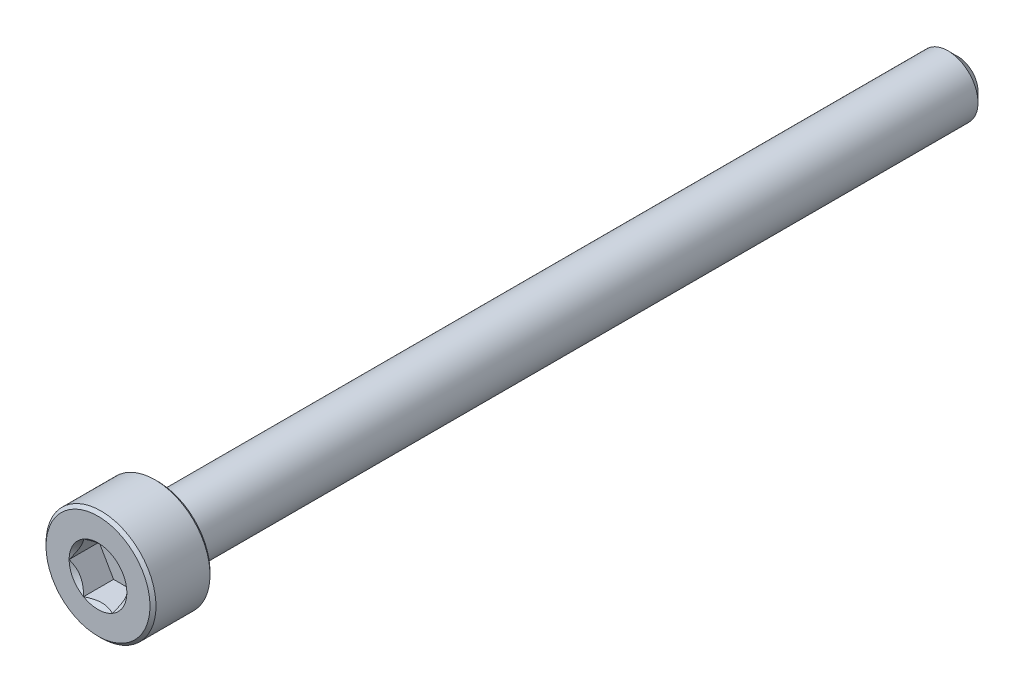
ISO-10303-21;
HEADER;
FILE_DESCRIPTION(('STEP AP214'),'2;1');
FILE_NAME('part.step','',(''),(''),'','','');
FILE_SCHEMA(('AUTOMOTIVE_DESIGN { 1 0 10303 214 1 1 1 1 }'));
ENDSEC;
DATA;
#1=APPLICATION_CONTEXT('core data for automotive mechanical design processes');
#2=APPLICATION_PROTOCOL_DEFINITION('international standard','automotive_design',2000,#1);
#3=PRODUCT_CONTEXT('',#1,'mechanical');
#4=PRODUCT('Part','Part','',(#3));
#5=PRODUCT_RELATED_PRODUCT_CATEGORY('part','',(#4));
#6=PRODUCT_DEFINITION_FORMATION('','',#4);
#7=PRODUCT_DEFINITION_CONTEXT('part definition',#1,'design');
#8=PRODUCT_DEFINITION('design','',#6,#7);
#9=PRODUCT_DEFINITION_SHAPE('','',#8);
#10=(LENGTH_UNIT() NAMED_UNIT(*) SI_UNIT(.MILLI.,.METRE.));
#11=(NAMED_UNIT(*) PLANE_ANGLE_UNIT() SI_UNIT($,.RADIAN.));
#12=(NAMED_UNIT(*) SI_UNIT($,.STERADIAN.) SOLID_ANGLE_UNIT());
#13=UNCERTAINTY_MEASURE_WITH_UNIT(LENGTH_MEASURE(1.E-05),#10,'distance_accuracy_value','');
#14=(GEOMETRIC_REPRESENTATION_CONTEXT(3) GLOBAL_UNCERTAINTY_ASSIGNED_CONTEXT((#13)) GLOBAL_UNIT_ASSIGNED_CONTEXT((#10,
#11,#12)) REPRESENTATION_CONTEXT('',''));
#15=CARTESIAN_POINT('',(0.,0.,0.));
#16=DIRECTION('',(0.,0.,1.));
#17=DIRECTION('',(1.,0.,0.));
#18=AXIS2_PLACEMENT_3D('',#15,#16,#17);
#19=CARTESIAN_POINT('',(1.44337567297406,0.,14.6811869208701));
#20=DIRECTION('',(0.866025403784439,0.5,0.));
#21=DIRECTION('',(0.,0.,-1.));
#22=AXIS2_PLACEMENT_3D('',#19,#20,#21);
#23=PLANE('',#22);
#24=DIRECTION('',(0.,0.,1.));
#25=VECTOR('',#24,1.);
#26=CARTESIAN_POINT('',(1.44337567297406,0.,14.6811869208701));
#27=LINE('',#26,#25);
#28=CARTESIAN_POINT('',(1.44337567297406,0.,20.));
#29=VERTEX_POINT('',#28);
#30=CARTESIAN_POINT('',(1.44337567297406,0.,21.5));
#31=VERTEX_POINT('',#30);
#32=EDGE_CURVE('E10',#29,#31,#27,.T.);
#33=ORIENTED_EDGE('',*,*,#32,.T.);
#34=CARTESIAN_POINT('',(1.44337567297406,0.,21.5));
#35=CARTESIAN_POINT('',(1.41857091071405,0.0429631085040134,21.475219039718));
#36=CARTESIAN_POINT('',(1.39335141059849,0.0866445640456523,21.4518937494627));
#37=CARTESIAN_POINT('',(1.34192626179312,0.175715534563346,21.4091861389099));
#38=CARTESIAN_POINT('',(1.31571572524133,0.221113515564678,21.389827573349));
#39=CARTESIAN_POINT('',(1.26286346737866,0.312656311477562,21.3566662159029));
#40=CARTESIAN_POINT('',(1.2362351986357,0.358777825857969,21.3427800967733));
#41=CARTESIAN_POINT('',(1.18239258914488,0.452035961108157,21.3213859017897));
#42=CARTESIAN_POINT('',(1.15517989206246,0.499169735065892,21.3138618619115));
#43=CARTESIAN_POINT('',(1.10827633065602,0.58040908647777,21.3070728277861));
#44=CARTESIAN_POINT('',(1.08864599684083,0.614409822015217,21.3060681886446));
#45=CARTESIAN_POINT('',(1.0494198823342,0.682351445324213,21.3077634952111));
#46=CARTESIAN_POINT('',(1.02982411023275,0.716292318217465,21.3104642592515));
#47=CARTESIAN_POINT('',(0.990821754325344,0.783846380263976,21.3194142483348));
#48=CARTESIAN_POINT('',(0.9714153635362,0.817459235102311,21.3256667730471));
#49=CARTESIAN_POINT('',(0.932926594125732,0.884123739242043,21.3413835392354));
#50=CARTESIAN_POINT('',(0.913844358232443,0.917175141331235,21.3508491588483));
#51=CARTESIAN_POINT('',(0.864994007906012,1.00178643006415,21.3789283315699));
#52=CARTESIAN_POINT('',(0.83553329850811,1.05281387556834,21.3996493450535));
#53=CARTESIAN_POINT('',(0.777764485738233,1.1528723943787,21.4463235058095));
#54=CARTESIAN_POINT('',(0.749452981901492,1.20190935746262,21.4722596212216));
#55=CARTESIAN_POINT('',(0.721687836487032,1.25,21.5));
#56=B_SPLINE_CURVE_WITH_KNOTS('',3,(#34,#35,#36,#37,#38,#39,#40,#41,#42,#43,#44,#45,#46,#47,#48,
#49,#50,#51,#52,#53,#54,#55),.UNSPECIFIED.,.F.,.F.,(4,2,2,2,2,2,2,2,2,2,4),(0.,
0.166478683225851,0.333926926832841,0.498716658518451,0.663091654628561,0.780745575560543,
0.898425484353583,1.01621489977236,1.13405490052654,1.32111591641584,1.50757565758619),.UNSPECIFIED.);
#57=CARTESIAN_POINT('',(0.721687836487031,1.25,21.5));
#58=VERTEX_POINT('',#57);
#59=EDGE_CURVE('E93',#31,#58,#56,.T.);
#60=ORIENTED_EDGE('',*,*,#59,.T.);
#61=DIRECTION('',(0.,0.,1.));
#62=VECTOR('',#61,1.);
#63=CARTESIAN_POINT('',(0.721687836487032,1.25,14.6811869208701));
#64=LINE('',#63,#62);
#65=CARTESIAN_POINT('',(0.721687836487032,1.25,20.));
#66=VERTEX_POINT('',#65);
#67=EDGE_CURVE('E76',#66,#58,#64,.T.);
#68=ORIENTED_EDGE('',*,*,#67,.F.);
#69=DIRECTION('',(0.5,-0.866025403784439,0.));
#70=VECTOR('',#69,1.);
#71=CARTESIAN_POINT('',(1.44337567297406,0.,20.));
#72=LINE('',#71,#70);
#73=EDGE_CURVE('E99',#66,#29,#72,.T.);
#74=ORIENTED_EDGE('',*,*,#73,.T.);
#75=EDGE_LOOP('',(#33,#60,#68,#74));
#76=FACE_BOUND('',#75,.T.);
#77=ADVANCED_FACE('F16',(#76),#23,.F.);
#78=CARTESIAN_POINT('',(0.721687836487031,-1.25,14.6811869208701));
#79=DIRECTION('',(0.866025403784438,-0.5,0.));
#80=DIRECTION('',(0.,0.,-1.));
#81=AXIS2_PLACEMENT_3D('',#78,#79,#80);
#82=PLANE('',#81);
#83=DIRECTION('',(0.,0.,1.));
#84=VECTOR('',#83,1.);
#85=CARTESIAN_POINT('',(0.721687836487031,-1.25,14.6811869208701));
#86=LINE('',#85,#84);
#87=CARTESIAN_POINT('',(0.721687836487031,-1.25,20.));
#88=VERTEX_POINT('',#87);
#89=CARTESIAN_POINT('',(0.721687836487031,-1.25,21.5));
#90=VERTEX_POINT('',#89);
#91=EDGE_CURVE('E33',#88,#90,#86,.T.);
#92=ORIENTED_EDGE('',*,*,#91,.T.);
#93=CARTESIAN_POINT('',(0.721687836487031,-1.25,21.5));
#94=CARTESIAN_POINT('',(0.746492598747046,-1.20703689149599,21.475219039718));
#95=CARTESIAN_POINT('',(0.771712098862606,-1.16335543595435,21.4518937494627));
#96=CARTESIAN_POINT('',(0.823137247667978,-1.07428446543665,21.4091861389099));
#97=CARTESIAN_POINT('',(0.849347784219763,-1.02888648443532,21.389827573349));
#98=CARTESIAN_POINT('',(0.902200042082437,-0.937343688522438,21.3566662159029));
#99=CARTESIAN_POINT('',(0.928828310825398,-0.891222174142031,21.3427800967733));
#100=CARTESIAN_POINT('',(0.982670920316217,-0.797964038891843,21.3213859017897));
#101=CARTESIAN_POINT('',(1.00988361739864,-0.750830264934107,21.3138618619115));
#102=CARTESIAN_POINT('',(1.05678717880508,-0.669590913522229,21.3070728277861));
#103=CARTESIAN_POINT('',(1.07641751262027,-0.635590177984782,21.3060681886446));
#104=CARTESIAN_POINT('',(1.1156436271269,-0.567648554675786,21.3077634952111));
#105=CARTESIAN_POINT('',(1.13523939922835,-0.533707681782534,21.3104642592515));
#106=CARTESIAN_POINT('',(1.17424175513575,-0.466153619736023,21.3194142483348));
#107=CARTESIAN_POINT('',(1.1936481459249,-0.432540764897688,21.3256667730471));
#108=CARTESIAN_POINT('',(1.23213691533536,-0.365876260757955,21.3413835392354));
#109=CARTESIAN_POINT('',(1.25121915122865,-0.332824858668765,21.3508491588483));
#110=CARTESIAN_POINT('',(1.30006950155508,-0.248213569935848,21.3789283315699));
#111=CARTESIAN_POINT('',(1.32953021095299,-0.19718612443166,21.3996493450535));
#112=CARTESIAN_POINT('',(1.38729902372286,-0.0971276056212981,21.4463235058095));
#113=CARTESIAN_POINT('',(1.4156105275596,-0.0480906425373826,21.4722596212216));
#114=CARTESIAN_POINT('',(1.44337567297406,0.,21.5));
#115=B_SPLINE_CURVE_WITH_KNOTS('',3,(#93,#94,#95,#96,#97,#98,#99,#100,#101,#102,#103,#104,#105,
#106,#107,#108,#109,#110,#111,#112,#113,#114),.UNSPECIFIED.,.F.,.F.,(4,2,2,2,2,2,2,2,2,2,4),(0.,
0.166478683225851,0.333926926832842,0.498716658518451,0.663091654628563,0.780745575560545,
0.898425484353586,1.01621489977237,1.13405490052654,1.32111591641584,1.5075756575862),.UNSPECIFIED.);
#116=EDGE_CURVE('E100',#90,#31,#115,.T.);
#117=ORIENTED_EDGE('',*,*,#116,.T.);
#118=ORIENTED_EDGE('',*,*,#32,.F.);
#119=DIRECTION('',(-0.5,-0.866025403784439,0.));
#120=VECTOR('',#119,1.);
#121=CARTESIAN_POINT('',(0.721687836487031,-1.25,20.));
#122=LINE('',#121,#120);
#123=EDGE_CURVE('E90',#29,#88,#122,.T.);
#124=ORIENTED_EDGE('',*,*,#123,.T.);
#125=EDGE_LOOP('',(#92,#117,#118,#124));
#126=FACE_BOUND('',#125,.T.);
#127=ADVANCED_FACE('F179',(#126),#82,.F.);
#128=CARTESIAN_POINT('',(-0.721687836487033,-1.25,14.6811869208701));
#129=DIRECTION('',(0.,-1.,0.));
#130=DIRECTION('',(-1.,0.,0.));
#131=AXIS2_PLACEMENT_3D('',#128,#129,#130);
#132=PLANE('',#131);
#133=DIRECTION('',(0.,0.,1.));
#134=VECTOR('',#133,1.);
#135=CARTESIAN_POINT('',(-0.721687836487033,-1.25,14.6811869208701));
#136=LINE('',#135,#134);
#137=CARTESIAN_POINT('',(-0.721687836487033,-1.25,20.));
#138=VERTEX_POINT('',#137);
#139=CARTESIAN_POINT('',(-0.721687836487033,-1.25,21.5));
#140=VERTEX_POINT('',#139);
#141=EDGE_CURVE('E139',#138,#140,#136,.T.);
#142=ORIENTED_EDGE('',*,*,#141,.T.);
#143=CARTESIAN_POINT('',(-0.721687836487033,-1.25,21.5));
#144=CARTESIAN_POINT('',(-0.672078311967002,-1.25,21.475219039718));
#145=CARTESIAN_POINT('',(-0.621639311735882,-1.25,21.4518937494627));
#146=CARTESIAN_POINT('',(-0.518789014125139,-1.25,21.4091861389099));
#147=CARTESIAN_POINT('',(-0.46636794102157,-1.25,21.389827573349));
#148=CARTESIAN_POINT('',(-0.360663425296221,-1.25,21.3566662159029));
#149=CARTESIAN_POINT('',(-0.307406887810299,-1.25,21.3427800967733));
#150=CARTESIAN_POINT('',(-0.199721668828662,-1.25,21.3213859017897));
#151=CARTESIAN_POINT('',(-0.145296274663819,-1.25,21.3138618619115));
#152=CARTESIAN_POINT('',(-0.0514891518509423,-1.25,21.3070728277861));
#153=CARTESIAN_POINT('',(-0.0122284842205616,-1.25,21.3060681886446));
#154=CARTESIAN_POINT('',(0.0662237447926961,-1.25,21.3077634952111));
#155=CARTESIAN_POINT('',(0.105415288995596,-1.25,21.3104642592515));
#156=CARTESIAN_POINT('',(0.183420000810408,-1.25,21.3194142483348));
#157=CARTESIAN_POINT('',(0.222232782388696,-1.25,21.3256667730471));
#158=CARTESIAN_POINT('',(0.299210321209632,-1.25,21.3413835392354));
#159=CARTESIAN_POINT('',(0.33737479299621,-1.25,21.3508491588483));
#160=CARTESIAN_POINT('',(0.435075493649071,-1.25,21.3789283315699));
#161=CARTESIAN_POINT('',(0.493996912444875,-1.25,21.3996493450535));
#162=CARTESIAN_POINT('',(0.60953453798463,-1.25,21.4463235058095));
#163=CARTESIAN_POINT('',(0.666157545658111,-1.25,21.4722596212216));
#164=CARTESIAN_POINT('',(0.721687836487031,-1.25,21.5));
#165=B_SPLINE_CURVE_WITH_KNOTS('',3,(#143,#144,#145,#146,#147,#148,#149,#150,#151,#152,#153,
#154,#155,#156,#157,#158,#159,#160,#161,#162,#163,#164),.UNSPECIFIED.,.F.,.F.,(4,2,2,2,2,2,2,2,
2,2,4),(0.,0.166478683225852,0.333926926832842,0.498716658518451,0.663091654628561,
0.780745575560543,0.898425484353584,1.01621489977236,1.13405490052654,1.32111591641584,
1.50757565758619),.UNSPECIFIED.);
#166=EDGE_CURVE('E180',#140,#90,#165,.T.);
#167=ORIENTED_EDGE('',*,*,#166,.T.);
#168=ORIENTED_EDGE('',*,*,#91,.F.);
#169=DIRECTION('',(-1.,0.,0.));
#170=VECTOR('',#169,1.);
#171=CARTESIAN_POINT('',(-0.721687836487033,-1.25,20.));
#172=LINE('',#171,#170);
#173=EDGE_CURVE('E437',#88,#138,#172,.T.);
#174=ORIENTED_EDGE('',*,*,#173,.T.);
#175=EDGE_LOOP('',(#142,#167,#168,#174));
#176=FACE_BOUND('',#175,.T.);
#177=ADVANCED_FACE('F175',(#176),#132,.F.);
#178=CARTESIAN_POINT('',(-1.44337567297406,0.,14.6811869208701));
#179=DIRECTION('',(-0.866025403784439,-0.5,0.));
#180=DIRECTION('',(-0.5,0.866025403784439,0.));
#181=AXIS2_PLACEMENT_3D('',#178,#179,#180);
#182=PLANE('',#181);
#183=DIRECTION('',(0.,0.,1.));
#184=VECTOR('',#183,1.);
#185=CARTESIAN_POINT('',(-1.44337567297406,0.,14.6811869208701));
#186=LINE('',#185,#184);
#187=CARTESIAN_POINT('',(-1.44337567297406,0.,20.));
#188=VERTEX_POINT('',#187);
#189=CARTESIAN_POINT('',(-1.44337567297406,0.,21.5));
#190=VERTEX_POINT('',#189);
#191=EDGE_CURVE('E146',#188,#190,#186,.T.);
#192=ORIENTED_EDGE('',*,*,#191,.T.);
#193=CARTESIAN_POINT('',(-1.44337567297406,0.,21.5));
#194=CARTESIAN_POINT('',(-1.41857091071405,-0.0429631085040118,21.475219039718));
#195=CARTESIAN_POINT('',(-1.39335141059849,-0.0866445640456508,21.4518937494627));
#196=CARTESIAN_POINT('',(-1.34192626179312,-0.175715534563344,21.4091861389099));
#197=CARTESIAN_POINT('',(-1.31571572524133,-0.221113515564677,21.389827573349));
#198=CARTESIAN_POINT('',(-1.26286346737866,-0.312656311477561,21.3566662159029));
#199=CARTESIAN_POINT('',(-1.2362351986357,-0.358777825857967,21.3427800967733));
#200=CARTESIAN_POINT('',(-1.18239258914488,-0.452035961108155,21.3213859017897));
#201=CARTESIAN_POINT('',(-1.15517989206246,-0.499169735065891,21.3138618619115));
#202=CARTESIAN_POINT('',(-1.10827633065602,-0.580409086477769,21.3070728277861));
#203=CARTESIAN_POINT('',(-1.08864599684083,-0.614409822015216,21.3060681886446));
#204=CARTESIAN_POINT('',(-1.0494198823342,-0.682351445324212,21.3077634952111));
#205=CARTESIAN_POINT('',(-1.02982411023275,-0.716292318217464,21.3104642592515));
#206=CARTESIAN_POINT('',(-0.990821754325344,-0.783846380263975,21.3194142483348));
#207=CARTESIAN_POINT('',(-0.9714153635362,-0.81745923510231,21.3256667730471));
#208=CARTESIAN_POINT('',(-0.932926594125732,-0.884123739242042,21.3413835392354));
#209=CARTESIAN_POINT('',(-0.913844358232443,-0.917175141331233,21.3508491588483));
#210=CARTESIAN_POINT('',(-0.864994007906013,-1.00178643006415,21.3789283315699));
#211=CARTESIAN_POINT('',(-0.83553329850811,-1.05281387556834,21.3996493450535));
#212=CARTESIAN_POINT('',(-0.777764485738232,-1.1528723943787,21.4463235058095));
#213=CARTESIAN_POINT('',(-0.749452981901492,-1.20190935746262,21.4722596212216));
#214=CARTESIAN_POINT('',(-0.721687836487032,-1.25,21.5));
#215=B_SPLINE_CURVE_WITH_KNOTS('',3,(#193,#194,#195,#196,#197,#198,#199,#200,#201,#202,#203,
#204,#205,#206,#207,#208,#209,#210,#211,#212,#213,#214),.UNSPECIFIED.,.F.,.F.,(4,2,2,2,2,2,2,2,
2,2,4),(0.,0.166478683225851,0.333926926832841,0.498716658518451,0.663091654628561,
0.780745575560544,0.898425484353584,1.01621489977236,1.13405490052654,1.32111591641584,
1.5075756575862),.UNSPECIFIED.);
#216=EDGE_CURVE('E187',#190,#140,#215,.T.);
#217=ORIENTED_EDGE('',*,*,#216,.T.);
#218=ORIENTED_EDGE('',*,*,#141,.F.);
#219=DIRECTION('',(-0.5,0.866025403784439,0.));
#220=VECTOR('',#219,1.);
#221=CARTESIAN_POINT('',(-1.44337567297406,0.,20.));
#222=LINE('',#221,#220);
#223=EDGE_CURVE('E435',#138,#188,#222,.T.);
#224=ORIENTED_EDGE('',*,*,#223,.T.);
#225=EDGE_LOOP('',(#192,#217,#218,#224));
#226=FACE_BOUND('',#225,.T.);
#227=ADVANCED_FACE('F178',(#226),#182,.F.);
#228=CARTESIAN_POINT('',(-0.721687836487032,1.25,14.6811869208701));
#229=DIRECTION('',(-0.866025403784439,0.5,0.));
#230=DIRECTION('',(0.,0.,1.));
#231=AXIS2_PLACEMENT_3D('',#228,#229,#230);
#232=PLANE('',#231);
#233=DIRECTION('',(0.,0.,1.));
#234=VECTOR('',#233,1.);
#235=CARTESIAN_POINT('',(-0.721687836487032,1.25,14.6811869208701));
#236=LINE('',#235,#234);
#237=CARTESIAN_POINT('',(-0.721687836487032,1.25,20.));
#238=VERTEX_POINT('',#237);
#239=CARTESIAN_POINT('',(-0.721687836487031,1.25,21.5));
#240=VERTEX_POINT('',#239);
#241=EDGE_CURVE('E89',#238,#240,#236,.T.);
#242=ORIENTED_EDGE('',*,*,#241,.T.);
#243=CARTESIAN_POINT('',(-0.721687836487032,1.25,21.5));
#244=CARTESIAN_POINT('',(-0.746492598747047,1.20703689149599,21.475219039718));
#245=CARTESIAN_POINT('',(-0.771712098862607,1.16335543595435,21.4518937494627));
#246=CARTESIAN_POINT('',(-0.823137247667978,1.07428446543665,21.4091861389099));
#247=CARTESIAN_POINT('',(-0.849347784219763,1.02888648443532,21.389827573349));
#248=CARTESIAN_POINT('',(-0.902200042082438,0.937343688522437,21.3566662159029));
#249=CARTESIAN_POINT('',(-0.928828310825399,0.89122217414203,21.3427800967733));
#250=CARTESIAN_POINT('',(-0.982670920316219,0.797964038891841,21.3213859017897));
#251=CARTESIAN_POINT('',(-1.00988361739864,0.750830264934106,21.3138618619115));
#252=CARTESIAN_POINT('',(-1.05678717880508,0.669590913522227,21.3070728277861));
#253=CARTESIAN_POINT('',(-1.07641751262027,0.63559017798478,21.3060681886446));
#254=CARTESIAN_POINT('',(-1.1156436271269,0.567648554675784,21.3077634952111));
#255=CARTESIAN_POINT('',(-1.13523939922835,0.533707681782532,21.3104642592515));
#256=CARTESIAN_POINT('',(-1.17424175513575,0.466153619736021,21.3194142483348));
#257=CARTESIAN_POINT('',(-1.1936481459249,0.432540764897687,21.3256667730471));
#258=CARTESIAN_POINT('',(-1.23213691533537,0.365876260757954,21.3413835392354));
#259=CARTESIAN_POINT('',(-1.25121915122865,0.332824858668763,21.3508491588483));
#260=CARTESIAN_POINT('',(-1.30006950155509,0.248213569935846,21.3789283315699));
#261=CARTESIAN_POINT('',(-1.32953021095299,0.197186124431659,21.3996493450535));
#262=CARTESIAN_POINT('',(-1.38729902372286,0.0971276056212985,21.4463235058095));
#263=CARTESIAN_POINT('',(-1.4156105275596,0.0480906425373836,21.4722596212216));
#264=CARTESIAN_POINT('',(-1.44337567297406,0.,21.5));
#265=B_SPLINE_CURVE_WITH_KNOTS('',3,(#243,#244,#245,#246,#247,#248,#249,#250,#251,#252,#253,
#254,#255,#256,#257,#258,#259,#260,#261,#262,#263,#264),.UNSPECIFIED.,.F.,.F.,(4,2,2,2,2,2,2,2,
2,2,4),(0.,0.166478683225851,0.333926926832842,0.498716658518453,0.663091654628565,
0.780745575560547,0.898425484353588,1.01621489977237,1.13405490052655,1.32111591641584,
1.50757565758619),.UNSPECIFIED.);
#266=EDGE_CURVE('E108',#240,#190,#265,.T.);
#267=ORIENTED_EDGE('',*,*,#266,.T.);
#268=ORIENTED_EDGE('',*,*,#191,.F.);
#269=DIRECTION('',(0.5,0.866025403784439,0.));
#270=VECTOR('',#269,1.);
#271=CARTESIAN_POINT('',(-0.721687836487032,1.25,20.));
#272=LINE('',#271,#270);
#273=EDGE_CURVE('E438',#188,#238,#272,.T.);
#274=ORIENTED_EDGE('',*,*,#273,.T.);
#275=EDGE_LOOP('',(#242,#267,#268,#274));
#276=FACE_BOUND('',#275,.T.);
#277=ADVANCED_FACE('F201',(#276),#232,.F.);
#278=CARTESIAN_POINT('',(0.721687836487032,1.25,14.6811869208701));
#279=DIRECTION('',(0.,1.,0.));
#280=DIRECTION('',(1.,0.,0.));
#281=AXIS2_PLACEMENT_3D('',#278,#279,#280);
#282=PLANE('',#281);
#283=ORIENTED_EDGE('',*,*,#67,.T.);
#284=CARTESIAN_POINT('',(0.721687836487031,1.25,21.5));
#285=CARTESIAN_POINT('',(0.672078311967001,1.25,21.475219039718));
#286=CARTESIAN_POINT('',(0.621639311735882,1.25,21.4518937494627));
#287=CARTESIAN_POINT('',(0.518789014125139,1.25,21.4091861389099));
#288=CARTESIAN_POINT('',(0.466367941021569,1.25,21.389827573349));
#289=CARTESIAN_POINT('',(0.360663425296221,1.25,21.3566662159029));
#290=CARTESIAN_POINT('',(0.307406887810299,1.25,21.3427800967733));
#291=CARTESIAN_POINT('',(0.199721668828662,1.25,21.3213859017897));
#292=CARTESIAN_POINT('',(0.14529627466382,1.25,21.3138618619115));
#293=CARTESIAN_POINT('',(0.0514891518509428,1.25,21.3070728277861));
#294=CARTESIAN_POINT('',(0.012228484220562,1.25,21.3060681886446));
#295=CARTESIAN_POINT('',(-0.0662237447926957,1.25,21.3077634952111));
#296=CARTESIAN_POINT('',(-0.105415288995596,1.25,21.3104642592515));
#297=CARTESIAN_POINT('',(-0.183420000810408,1.25,21.3194142483348));
#298=CARTESIAN_POINT('',(-0.222232782388696,1.25,21.3256667730471));
#299=CARTESIAN_POINT('',(-0.299210321209631,1.25,21.3413835392354));
#300=CARTESIAN_POINT('',(-0.337374792996209,1.25,21.3508491588483));
#301=CARTESIAN_POINT('',(-0.435075493649071,1.25,21.3789283315699));
#302=CARTESIAN_POINT('',(-0.493996912444875,1.25,21.3996493450535));
#303=CARTESIAN_POINT('',(-0.60953453798463,1.25,21.4463235058095));
#304=CARTESIAN_POINT('',(-0.666157545658111,1.25,21.4722596212216));
#305=CARTESIAN_POINT('',(-0.721687836487031,1.25,21.5));
#306=B_SPLINE_CURVE_WITH_KNOTS('',3,(#284,#285,#286,#287,#288,#289,#290,#291,#292,#293,#294,
#295,#296,#297,#298,#299,#300,#301,#302,#303,#304,#305),.UNSPECIFIED.,.F.,.F.,(4,2,2,2,2,2,2,2,
2,2,4),(0.,0.166478683225851,0.33392692683284,0.498716658518449,0.663091654628559,
0.780745575560541,0.898425484353582,1.01621489977236,1.13405490052654,1.32111591641584,
1.50757565758619),.UNSPECIFIED.);
#307=EDGE_CURVE('E20',#58,#240,#306,.T.);
#308=ORIENTED_EDGE('',*,*,#307,.T.);
#309=ORIENTED_EDGE('',*,*,#241,.F.);
#310=DIRECTION('',(1.,0.,0.));
#311=VECTOR('',#310,1.);
#312=CARTESIAN_POINT('',(0.721687836487032,1.25,20.));
#313=LINE('',#312,#311);
#314=EDGE_CURVE('E84',#238,#66,#313,.T.);
#315=ORIENTED_EDGE('',*,*,#314,.T.);
#316=EDGE_LOOP('',(#283,#308,#309,#315));
#317=FACE_BOUND('',#316,.T.);
#318=ADVANCED_FACE('F78',(#317),#282,.F.);
#319=CARTESIAN_POINT('',(0.,2.6,20.));
#320=DIRECTION('',(0.,0.,1.));
#321=DIRECTION('',(1.,0.,0.));
#322=AXIS2_PLACEMENT_3D('',#319,#320,#321);
#323=PLANE('',#322);
#324=ORIENTED_EDGE('',*,*,#73,.F.);
#325=ORIENTED_EDGE('',*,*,#314,.F.);
#326=ORIENTED_EDGE('',*,*,#273,.F.);
#327=ORIENTED_EDGE('',*,*,#223,.F.);
#328=ORIENTED_EDGE('',*,*,#173,.F.);
#329=ORIENTED_EDGE('',*,*,#123,.F.);
#330=EDGE_LOOP('',(#324,#325,#326,#327,#328,#329));
#331=FACE_BOUND('',#330,.T.);
#332=ADVANCED_FACE('F172',(#331),#323,.T.);
#333=CARTESIAN_POINT('',(0.,0.,21.5));
#334=DIRECTION('',(0.,0.,1.));
#335=DIRECTION('',(1.,0.,0.));
#336=AXIS2_PLACEMENT_3D('',#333,#334,#335);
#337=CONICAL_SURFACE('',#336,1.44337567297406,0.78539816339745);
#338=CARTESIAN_POINT('',(0.,0.,21.5));
#339=DIRECTION('',(0.,0.,1.));
#340=DIRECTION('',(1.,0.,0.));
#341=AXIS2_PLACEMENT_3D('',#338,#339,#340);
#342=CIRCLE('',#341,1.44337567297406);
#343=EDGE_CURVE('E114',#31,#58,#342,.T.);
#344=ORIENTED_EDGE('',*,*,#343,.T.);
#345=ORIENTED_EDGE('',*,*,#59,.F.);
#346=EDGE_LOOP('',(#344,#345));
#347=FACE_BOUND('',#346,.T.);
#348=ADVANCED_FACE('F120',(#347),#337,.F.);
#349=CARTESIAN_POINT('',(0.,0.,21.5));
#350=DIRECTION('',(0.,0.,1.));
#351=DIRECTION('',(1.,0.,0.));
#352=AXIS2_PLACEMENT_3D('',#349,#350,#351);
#353=CONICAL_SURFACE('',#352,1.44337567297406,0.78539816339745);
#354=CARTESIAN_POINT('',(0.,0.,21.5));
#355=DIRECTION('',(0.,0.,1.));
#356=DIRECTION('',(1.,0.,0.));
#357=AXIS2_PLACEMENT_3D('',#354,#355,#356);
#358=CIRCLE('',#357,1.44337567297406);
#359=EDGE_CURVE('E122',#90,#31,#358,.T.);
#360=ORIENTED_EDGE('',*,*,#359,.T.);
#361=ORIENTED_EDGE('',*,*,#116,.F.);
#362=EDGE_LOOP('',(#360,#361));
#363=FACE_BOUND('',#362,.T.);
#364=ADVANCED_FACE('F171',(#363),#353,.F.);
#365=CARTESIAN_POINT('',(0.,0.,21.5));
#366=DIRECTION('',(0.,0.,1.));
#367=DIRECTION('',(1.,0.,0.));
#368=AXIS2_PLACEMENT_3D('',#365,#366,#367);
#369=CONICAL_SURFACE('',#368,1.44337567297406,0.78539816339745);
#370=CARTESIAN_POINT('',(0.,0.,21.5));
#371=DIRECTION('',(0.,0.,1.));
#372=DIRECTION('',(1.,0.,0.));
#373=AXIS2_PLACEMENT_3D('',#370,#371,#372);
#374=CIRCLE('',#373,1.44337567297406);
#375=EDGE_CURVE('E130',#140,#90,#374,.T.);
#376=ORIENTED_EDGE('',*,*,#375,.T.);
#377=ORIENTED_EDGE('',*,*,#166,.F.);
#378=EDGE_LOOP('',(#376,#377));
#379=FACE_BOUND('',#378,.T.);
#380=ADVANCED_FACE('F194',(#379),#369,.F.);
#381=CARTESIAN_POINT('',(0.,0.,21.5));
#382=DIRECTION('',(0.,0.,1.));
#383=DIRECTION('',(1.,0.,0.));
#384=AXIS2_PLACEMENT_3D('',#381,#382,#383);
#385=CONICAL_SURFACE('',#384,1.44337567297406,0.78539816339745);
#386=CARTESIAN_POINT('',(0.,0.,21.5));
#387=DIRECTION('',(0.,0.,1.));
#388=DIRECTION('',(1.,0.,0.));
#389=AXIS2_PLACEMENT_3D('',#386,#387,#388);
#390=CIRCLE('',#389,1.44337567297406);
#391=EDGE_CURVE('E143',#190,#140,#390,.T.);
#392=ORIENTED_EDGE('',*,*,#391,.T.);
#393=ORIENTED_EDGE('',*,*,#216,.F.);
#394=EDGE_LOOP('',(#392,#393));
#395=FACE_BOUND('',#394,.T.);
#396=ADVANCED_FACE('F197',(#395),#385,.F.);
#397=CARTESIAN_POINT('',(0.,0.,21.5));
#398=DIRECTION('',(0.,0.,1.));
#399=DIRECTION('',(1.,0.,0.));
#400=AXIS2_PLACEMENT_3D('',#397,#398,#399);
#401=CONICAL_SURFACE('',#400,1.44337567297406,0.78539816339745);
#402=CARTESIAN_POINT('',(0.,0.,21.5));
#403=DIRECTION('',(0.,0.,1.));
#404=DIRECTION('',(1.,0.,0.));
#405=AXIS2_PLACEMENT_3D('',#402,#403,#404);
#406=CIRCLE('',#405,1.44337567297406);
#407=EDGE_CURVE('E117',#240,#190,#406,.T.);
#408=ORIENTED_EDGE('',*,*,#407,.T.);
#409=ORIENTED_EDGE('',*,*,#266,.F.);
#410=EDGE_LOOP('',(#408,#409));
#411=FACE_BOUND('',#410,.T.);
#412=ADVANCED_FACE('F209',(#411),#401,.F.);
#413=CARTESIAN_POINT('',(0.,0.,21.5));
#414=DIRECTION('',(0.,0.,1.));
#415=DIRECTION('',(1.,0.,0.));
#416=AXIS2_PLACEMENT_3D('',#413,#414,#415);
#417=CONICAL_SURFACE('',#416,1.44337567297406,0.78539816339745);
#418=CARTESIAN_POINT('',(0.,0.,21.5));
#419=DIRECTION('',(0.,0.,1.));
#420=DIRECTION('',(1.,0.,0.));
#421=AXIS2_PLACEMENT_3D('',#418,#419,#420);
#422=CIRCLE('',#421,1.44337567297406);
#423=EDGE_CURVE('E105',#58,#240,#422,.T.);
#424=ORIENTED_EDGE('',*,*,#423,.T.);
#425=ORIENTED_EDGE('',*,*,#307,.F.);
#426=EDGE_LOOP('',(#424,#425));
#427=FACE_BOUND('',#426,.T.);
#428=ADVANCED_FACE('F104',(#427),#417,.F.);
#429=CARTESIAN_POINT('',(0.,1.,-21.5));
#430=DIRECTION('',(0.,0.,-1.));
#431=DIRECTION('',(0.,-1.,0.));
#432=AXIS2_PLACEMENT_3D('',#429,#430,#431);
#433=PLANE('',#432);
#434=CARTESIAN_POINT('',(0.,0.,-21.5));
#435=DIRECTION('',(0.,0.,-1.));
#436=DIRECTION('',(-1.,0.,0.));
#437=AXIS2_PLACEMENT_3D('',#434,#435,#436);
#438=CIRCLE('',#437,1.);
#439=CARTESIAN_POINT('',(-1.,0.,-21.5));
#440=VERTEX_POINT('',#439);
#441=EDGE_CURVE('E416',#440,#440,#438,.T.);
#442=ORIENTED_EDGE('',*,*,#441,.T.);
#443=EDGE_LOOP('',(#442));
#444=FACE_BOUND('',#443,.T.);
#445=ADVANCED_FACE('F208',(#444),#433,.T.);
#446=CARTESIAN_POINT('',(0.,2.6,18.5));
#447=DIRECTION('',(0.,0.,-1.));
#448=DIRECTION('',(0.,-1.,0.));
#449=AXIS2_PLACEMENT_3D('',#446,#447,#448);
#450=PLANE('',#449);
#451=CARTESIAN_POINT('',(0.,0.,18.5));
#452=DIRECTION('',(0.,0.,-1.));
#453=DIRECTION('',(-1.,0.,0.));
#454=AXIS2_PLACEMENT_3D('',#451,#452,#453);
#455=CIRCLE('',#454,1.5);
#456=CARTESIAN_POINT('',(-1.5,0.,18.5));
#457=VERTEX_POINT('',#456);
#458=EDGE_CURVE('E401',#457,#457,#455,.T.);
#459=ORIENTED_EDGE('',*,*,#458,.F.);
#460=EDGE_LOOP('',(#459));
#461=FACE_BOUND('',#460,.T.);
#462=CARTESIAN_POINT('',(0.,0.,18.5));
#463=DIRECTION('',(0.,0.,-1.));
#464=DIRECTION('',(-1.,0.,0.));
#465=AXIS2_PLACEMENT_3D('',#462,#463,#464);
#466=CIRCLE('',#465,2.6);
#467=CARTESIAN_POINT('',(-2.6,0.,18.5));
#468=VERTEX_POINT('',#467);
#469=EDGE_CURVE('E392',#468,#468,#466,.T.);
#470=ORIENTED_EDGE('',*,*,#469,.T.);
#471=EDGE_LOOP('',(#470));
#472=FACE_BOUND('',#471,.T.);
#473=ADVANCED_FACE('F210',(#461,#472),#450,.T.);
#474=CARTESIAN_POINT('',(0.,2.6,21.5));
#475=DIRECTION('',(0.,0.,1.));
#476=DIRECTION('',(1.,0.,0.));
#477=AXIS2_PLACEMENT_3D('',#474,#475,#476);
#478=PLANE('',#477);
#479=ORIENTED_EDGE('',*,*,#343,.F.);
#480=ORIENTED_EDGE('',*,*,#359,.F.);
#481=ORIENTED_EDGE('',*,*,#375,.F.);
#482=ORIENTED_EDGE('',*,*,#391,.F.);
#483=ORIENTED_EDGE('',*,*,#407,.F.);
#484=ORIENTED_EDGE('',*,*,#423,.F.);
#485=EDGE_LOOP('',(#479,#480,#481,#482,#483,#484));
#486=FACE_BOUND('',#485,.T.);
#487=CARTESIAN_POINT('',(0.,0.,21.5));
#488=DIRECTION('',(0.,0.,-1.));
#489=DIRECTION('',(-1.,0.,0.));
#490=AXIS2_PLACEMENT_3D('',#487,#488,#489);
#491=CIRCLE('',#490,2.6);
#492=CARTESIAN_POINT('',(-2.6,0.,21.5));
#493=VERTEX_POINT('',#492);
#494=EDGE_CURVE('E123',#493,#493,#491,.T.);
#495=ORIENTED_EDGE('',*,*,#494,.F.);
#496=EDGE_LOOP('',(#495));
#497=FACE_BOUND('',#496,.T.);
#498=ADVANCED_FACE('F111',(#486,#497),#478,.T.);
#499=CARTESIAN_POINT('',(0.,0.,21.35));
#500=DIRECTION('',(0.,0.,-1.));
#501=DIRECTION('',(-1.,0.,0.));
#502=AXIS2_PLACEMENT_3D('',#499,#500,#501);
#503=CONICAL_SURFACE('',#502,2.75,0.785398163397435);
#504=CARTESIAN_POINT('',(0.,0.,21.35));
#505=DIRECTION('',(0.,0.,-1.));
#506=DIRECTION('',(-1.,0.,0.));
#507=AXIS2_PLACEMENT_3D('',#504,#505,#506);
#508=CIRCLE('',#507,2.75);
#509=CARTESIAN_POINT('',(-2.75,0.,21.35));
#510=VERTEX_POINT('',#509);
#511=EDGE_CURVE('E134',#510,#510,#508,.T.);
#512=ORIENTED_EDGE('',*,*,#511,.F.);
#513=EDGE_LOOP('',(#512));
#514=FACE_BOUND('',#513,.T.);
#515=ORIENTED_EDGE('',*,*,#494,.T.);
#516=EDGE_LOOP('',(#515));
#517=FACE_BOUND('',#516,.T.);
#518=ADVANCED_FACE('F215',(#514,#517),#503,.T.);
#519=CARTESIAN_POINT('',(0.,0.,-21.5));
#520=DIRECTION('',(0.,0.,-1.));
#521=DIRECTION('',(-1.,0.,0.));
#522=AXIS2_PLACEMENT_3D('',#519,#520,#521);
#523=CYLINDRICAL_SURFACE('',#522,2.75);
#524=CARTESIAN_POINT('',(0.,0.,18.65));
#525=DIRECTION('',(0.,0.,-1.));
#526=DIRECTION('',(-1.,0.,0.));
#527=AXIS2_PLACEMENT_3D('',#524,#525,#526);
#528=CIRCLE('',#527,2.75);
#529=CARTESIAN_POINT('',(-2.75,0.,18.65));
#530=VERTEX_POINT('',#529);
#531=EDGE_CURVE('E382',#530,#530,#528,.T.);
#532=ORIENTED_EDGE('',*,*,#531,.F.);
#533=EDGE_LOOP('',(#532));
#534=FACE_BOUND('',#533,.T.);
#535=ORIENTED_EDGE('',*,*,#511,.T.);
#536=EDGE_LOOP('',(#535));
#537=FACE_BOUND('',#536,.T.);
#538=ADVANCED_FACE('F222',(#534,#537),#523,.T.);
#539=CARTESIAN_POINT('',(0.,0.,18.5));
#540=DIRECTION('',(0.,0.,1.));
#541=DIRECTION('',(1.,0.,0.));
#542=AXIS2_PLACEMENT_3D('',#539,#540,#541);
#543=CONICAL_SURFACE('',#542,2.6,0.78539816339746);
#544=ORIENTED_EDGE('',*,*,#531,.T.);
#545=EDGE_LOOP('',(#544));
#546=FACE_BOUND('',#545,.T.);
#547=ORIENTED_EDGE('',*,*,#469,.F.);
#548=EDGE_LOOP('',(#547));
#549=FACE_BOUND('',#548,.T.);
#550=ADVANCED_FACE('F229',(#546,#549),#543,.T.);
#551=CARTESIAN_POINT('',(0.,0.,-21.5));
#552=DIRECTION('',(0.,0.,-1.));
#553=DIRECTION('',(-1.,0.,0.));
#554=AXIS2_PLACEMENT_3D('',#551,#552,#553);
#555=CYLINDRICAL_SURFACE('',#554,1.5);
#556=CARTESIAN_POINT('',(0.,0.,-21.));
#557=DIRECTION('',(0.,0.,-1.));
#558=DIRECTION('',(-1.,0.,0.));
#559=AXIS2_PLACEMENT_3D('',#556,#557,#558);
#560=CIRCLE('',#559,1.5);
#561=CARTESIAN_POINT('',(-1.5,0.,-21.));
#562=VERTEX_POINT('',#561);
#563=EDGE_CURVE('E408',#562,#562,#560,.T.);
#564=ORIENTED_EDGE('',*,*,#563,.F.);
#565=EDGE_LOOP('',(#564));
#566=FACE_BOUND('',#565,.T.);
#567=ORIENTED_EDGE('',*,*,#458,.T.);
#568=EDGE_LOOP('',(#567));
#569=FACE_BOUND('',#568,.T.);
#570=ADVANCED_FACE('F252',(#566,#569),#555,.T.);
#571=CARTESIAN_POINT('',(0.,0.,-21.5));
#572=DIRECTION('',(0.,0.,1.));
#573=DIRECTION('',(1.,0.,0.));
#574=AXIS2_PLACEMENT_3D('',#571,#572,#573);
#575=CONICAL_SURFACE('',#574,1.,0.785398163397443);
#576=ORIENTED_EDGE('',*,*,#563,.T.);
#577=EDGE_LOOP('',(#576));
#578=FACE_BOUND('',#577,.T.);
#579=ORIENTED_EDGE('',*,*,#441,.F.);
#580=EDGE_LOOP('',(#579));
#581=FACE_BOUND('',#580,.T.);
#582=ADVANCED_FACE('F254',(#578,#581),#575,.T.);
#583=CLOSED_SHELL('',(#77,#127,#177,#227,#277,#318,#332,#348,#364,#380,#396,#412,#428,#445,#473,
#498,#518,#538,#550,#570,#582));
#584=MANIFOLD_SOLID_BREP('B1',#583);
#585=ADVANCED_BREP_SHAPE_REPRESENTATION('',(#18,#584),#14);
#586=SHAPE_DEFINITION_REPRESENTATION(#9,#585);
ENDSEC;
END-ISO-10303-21;
